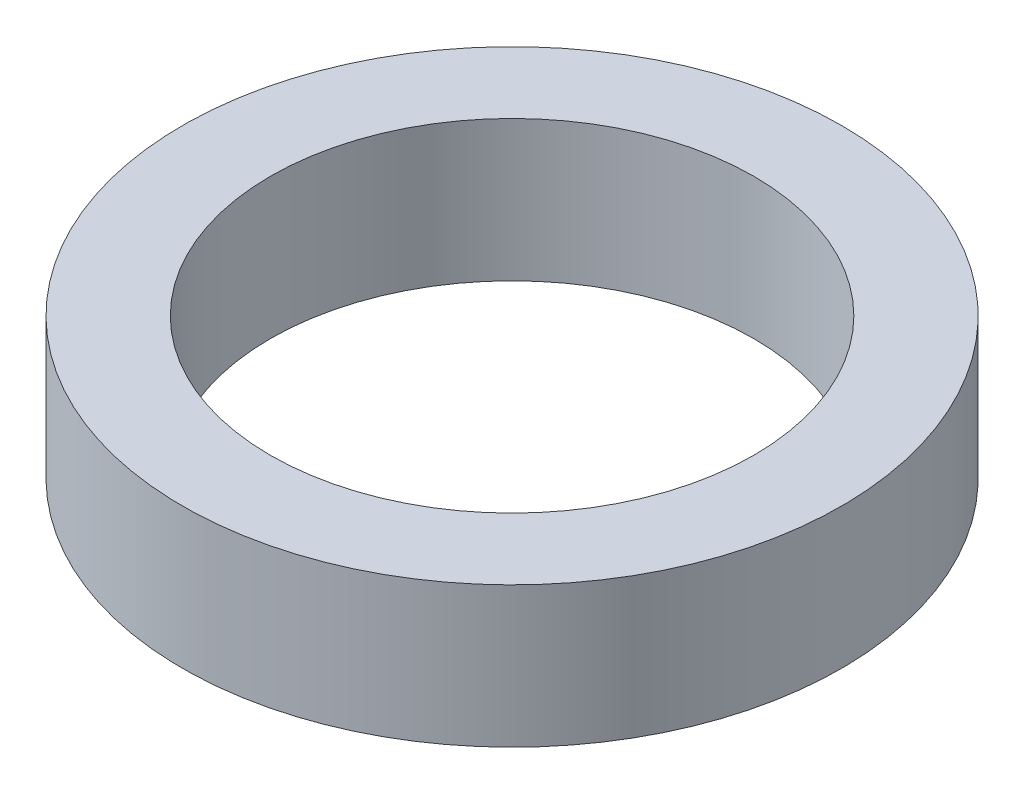
ISO-10303-21;
HEADER;
FILE_DESCRIPTION(('STEP AP214'),'2;1');
FILE_NAME('part.step','',(''),(''),'','','');
FILE_SCHEMA(('AUTOMOTIVE_DESIGN { 1 0 10303 214 1 1 1 1 }'));
ENDSEC;
DATA;
#1=APPLICATION_CONTEXT('core data for automotive mechanical design processes');
#2=APPLICATION_PROTOCOL_DEFINITION('international standard','automotive_design',2000,#1);
#3=PRODUCT_CONTEXT('',#1,'mechanical');
#4=PRODUCT('Part','Part','',(#3));
#5=PRODUCT_RELATED_PRODUCT_CATEGORY('part','',(#4));
#6=PRODUCT_DEFINITION_FORMATION('','',#4);
#7=PRODUCT_DEFINITION_CONTEXT('part definition',#1,'design');
#8=PRODUCT_DEFINITION('design','',#6,#7);
#9=PRODUCT_DEFINITION_SHAPE('','',#8);
#10=(LENGTH_UNIT() NAMED_UNIT(*) SI_UNIT(.MILLI.,.METRE.));
#11=(NAMED_UNIT(*) PLANE_ANGLE_UNIT() SI_UNIT($,.RADIAN.));
#12=(NAMED_UNIT(*) SI_UNIT($,.STERADIAN.) SOLID_ANGLE_UNIT());
#13=UNCERTAINTY_MEASURE_WITH_UNIT(LENGTH_MEASURE(1.E-05),#10,'distance_accuracy_value','');
#14=(GEOMETRIC_REPRESENTATION_CONTEXT(3) GLOBAL_UNCERTAINTY_ASSIGNED_CONTEXT((#13)) GLOBAL_UNIT_ASSIGNED_CONTEXT((#10,
#11,#12)) REPRESENTATION_CONTEXT('',''));
#15=CARTESIAN_POINT('',(0.,0.,0.));
#16=DIRECTION('',(0.,0.,1.));
#17=DIRECTION('',(1.,0.,0.));
#18=AXIS2_PLACEMENT_3D('',#15,#16,#17);
#19=CARTESIAN_POINT('',(0.,16.,0.));
#20=DIRECTION('',(0.,1.,0.));
#21=DIRECTION('',(0.,0.,1.));
#22=AXIS2_PLACEMENT_3D('',#19,#20,#21);
#23=PLANE('',#22);
#24=CARTESIAN_POINT('',(0.,16.,0.));
#25=DIRECTION('',(0.,-1.,0.));
#26=DIRECTION('',(0.,0.,-1.));
#27=AXIS2_PLACEMENT_3D('',#24,#25,#26);
#28=CIRCLE('',#27,37.5);
#29=CARTESIAN_POINT('',(0.,16.,-37.5));
#30=VERTEX_POINT('',#29);
#31=EDGE_CURVE('E26',#30,#30,#28,.T.);
#32=ORIENTED_EDGE('',*,*,#31,.F.);
#33=EDGE_LOOP('',(#32));
#34=FACE_BOUND('',#33,.T.);
#35=CARTESIAN_POINT('',(0.,16.,0.));
#36=DIRECTION('',(0.,1.,0.));
#37=DIRECTION('',(0.,0.,1.));
#38=AXIS2_PLACEMENT_3D('',#35,#36,#37);
#39=CIRCLE('',#38,27.5);
#40=CARTESIAN_POINT('',(0.,16.,27.5));
#41=VERTEX_POINT('',#40);
#42=EDGE_CURVE('E17',#41,#41,#39,.F.);
#43=ORIENTED_EDGE('',*,*,#42,.T.);
#44=EDGE_LOOP('',(#43));
#45=FACE_BOUND('',#44,.T.);
#46=ADVANCED_FACE('F14',(#34,#45),#23,.T.);
#47=CARTESIAN_POINT('',(0.,0.,0.));
#48=DIRECTION('',(0.,1.,0.));
#49=DIRECTION('',(0.,0.,1.));
#50=AXIS2_PLACEMENT_3D('',#47,#48,#49);
#51=CYLINDRICAL_SURFACE('',#50,27.5);
#52=CARTESIAN_POINT('',(0.,0.,0.));
#53=DIRECTION('',(0.,1.,0.));
#54=DIRECTION('',(0.,0.,1.));
#55=AXIS2_PLACEMENT_3D('',#52,#53,#54);
#56=CIRCLE('',#55,27.5);
#57=CARTESIAN_POINT('',(0.,0.,27.5));
#58=VERTEX_POINT('',#57);
#59=EDGE_CURVE('E21',#58,#58,#56,.F.);
#60=ORIENTED_EDGE('',*,*,#59,.T.);
#61=EDGE_LOOP('',(#60));
#62=FACE_BOUND('',#61,.T.);
#63=ORIENTED_EDGE('',*,*,#42,.F.);
#64=EDGE_LOOP('',(#63));
#65=FACE_BOUND('',#64,.T.);
#66=ADVANCED_FACE('F35',(#62,#65),#51,.F.);
#67=CARTESIAN_POINT('',(0.,16.,0.));
#68=DIRECTION('',(0.,-1.,0.));
#69=DIRECTION('',(0.,0.,-1.));
#70=AXIS2_PLACEMENT_3D('',#67,#68,#69);
#71=CYLINDRICAL_SURFACE('',#70,37.5);
#72=ORIENTED_EDGE('',*,*,#31,.T.);
#73=EDGE_LOOP('',(#72));
#74=FACE_BOUND('',#73,.T.);
#75=CARTESIAN_POINT('',(0.,0.,0.));
#76=DIRECTION('',(0.,-1.,0.));
#77=DIRECTION('',(0.,0.,-1.));
#78=AXIS2_PLACEMENT_3D('',#75,#76,#77);
#79=CIRCLE('',#78,37.5);
#80=CARTESIAN_POINT('',(0.,0.,-37.5));
#81=VERTEX_POINT('',#80);
#82=EDGE_CURVE('E10',#81,#81,#79,.F.);
#83=ORIENTED_EDGE('',*,*,#82,.T.);
#84=EDGE_LOOP('',(#83));
#85=FACE_BOUND('',#84,.T.);
#86=ADVANCED_FACE('F37',(#74,#85),#71,.T.);
#87=CARTESIAN_POINT('',(0.,0.,0.));
#88=DIRECTION('',(0.,1.,0.));
#89=DIRECTION('',(0.,0.,1.));
#90=AXIS2_PLACEMENT_3D('',#87,#88,#89);
#91=PLANE('',#90);
#92=ORIENTED_EDGE('',*,*,#82,.F.);
#93=EDGE_LOOP('',(#92));
#94=FACE_BOUND('',#93,.T.);
#95=ORIENTED_EDGE('',*,*,#59,.F.);
#96=EDGE_LOOP('',(#95));
#97=FACE_BOUND('',#96,.T.);
#98=ADVANCED_FACE('F45',(#94,#97),#91,.F.);
#99=CLOSED_SHELL('',(#46,#66,#86,#98));
#100=MANIFOLD_SOLID_BREP('B1',#99);
#101=ADVANCED_BREP_SHAPE_REPRESENTATION('',(#18,#100),#14);
#102=SHAPE_DEFINITION_REPRESENTATION(#9,#101);
ENDSEC;
END-ISO-10303-21;
